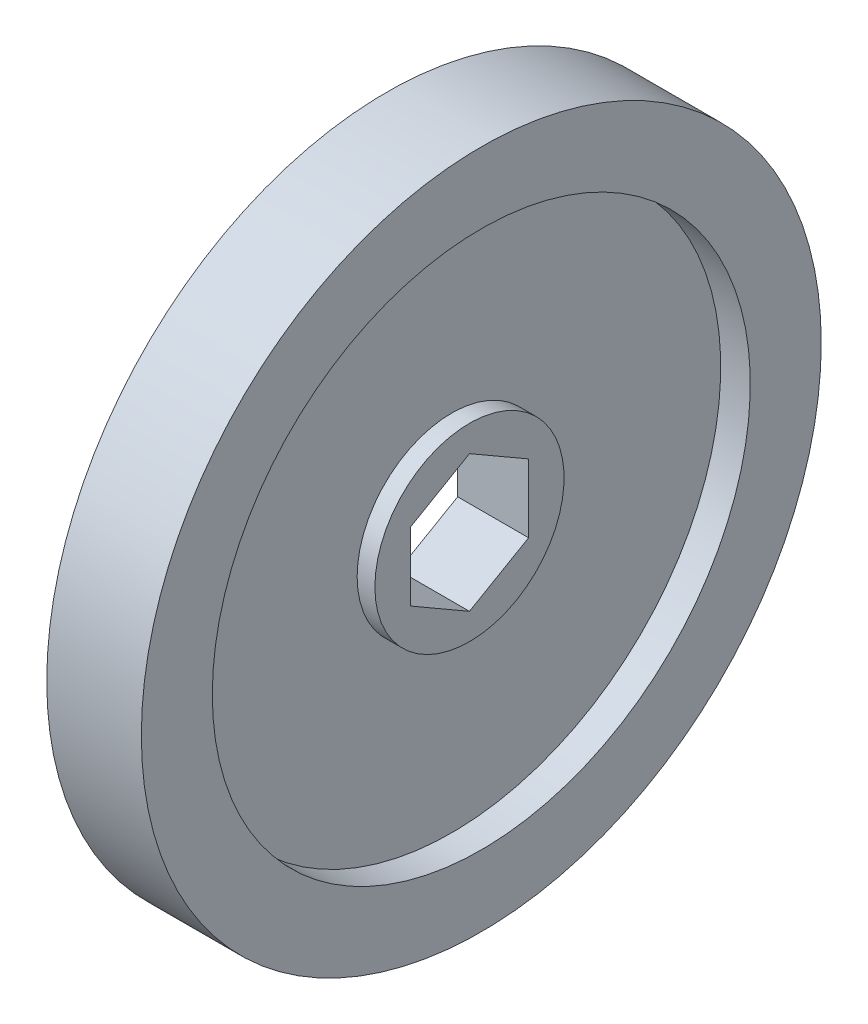
ISO-10303-21;
HEADER;
FILE_DESCRIPTION(('STEP AP214'),'2;1');
FILE_NAME('part.step','',(''),(''),'','','');
FILE_SCHEMA(('AUTOMOTIVE_DESIGN { 1 0 10303 214 1 1 1 1 }'));
ENDSEC;
DATA;
#1=APPLICATION_CONTEXT('core data for automotive mechanical design processes');
#2=APPLICATION_PROTOCOL_DEFINITION('international standard','automotive_design',2000,#1);
#3=PRODUCT_CONTEXT('',#1,'mechanical');
#4=PRODUCT('Part','Part','',(#3));
#5=PRODUCT_RELATED_PRODUCT_CATEGORY('part','',(#4));
#6=PRODUCT_DEFINITION_FORMATION('','',#4);
#7=PRODUCT_DEFINITION_CONTEXT('part definition',#1,'design');
#8=PRODUCT_DEFINITION('design','',#6,#7);
#9=PRODUCT_DEFINITION_SHAPE('','',#8);
#10=(LENGTH_UNIT() NAMED_UNIT(*) SI_UNIT(.MILLI.,.METRE.));
#11=(NAMED_UNIT(*) PLANE_ANGLE_UNIT() SI_UNIT($,.RADIAN.));
#12=(NAMED_UNIT(*) SI_UNIT($,.STERADIAN.) SOLID_ANGLE_UNIT());
#13=UNCERTAINTY_MEASURE_WITH_UNIT(LENGTH_MEASURE(1.E-05),#10,'distance_accuracy_value','');
#14=(GEOMETRIC_REPRESENTATION_CONTEXT(3) GLOBAL_UNCERTAINTY_ASSIGNED_CONTEXT((#13)) GLOBAL_UNIT_ASSIGNED_CONTEXT((#10,
#11,#12)) REPRESENTATION_CONTEXT('',''));
#15=CARTESIAN_POINT('',(0.,0.,0.));
#16=DIRECTION('',(0.,0.,1.));
#17=DIRECTION('',(1.,0.,0.));
#18=AXIS2_PLACEMENT_3D('',#15,#16,#17);
#19=CARTESIAN_POINT('',(5.08,36.5125,0.));
#20=DIRECTION('',(-1.,0.,0.));
#21=DIRECTION('',(0.,0.,1.));
#22=AXIS2_PLACEMENT_3D('',#19,#20,#21);
#23=PLANE('',#22);
#24=CARTESIAN_POINT('',(5.08,0.,0.));
#25=DIRECTION('',(-1.,0.,0.));
#26=DIRECTION('',(0.,0.,1.));
#27=AXIS2_PLACEMENT_3D('',#24,#25,#26);
#28=CIRCLE('',#27,36.5125);
#29=CARTESIAN_POINT('',(5.08,0.,36.5125));
#30=VERTEX_POINT('',#29);
#31=EDGE_CURVE('E118',#30,#30,#28,.T.);
#32=ORIENTED_EDGE('',*,*,#31,.F.);
#33=EDGE_LOOP('',(#32));
#34=FACE_BOUND('',#33,.T.);
#35=CARTESIAN_POINT('',(5.08,0.,0.));
#36=DIRECTION('',(-1.,0.,0.));
#37=DIRECTION('',(0.,0.,1.));
#38=AXIS2_PLACEMENT_3D('',#35,#36,#37);
#39=CIRCLE('',#38,28.8925);
#40=CARTESIAN_POINT('',(5.08,0.,28.8925));
#41=VERTEX_POINT('',#40);
#42=EDGE_CURVE('E151',#41,#41,#39,.T.);
#43=ORIENTED_EDGE('',*,*,#42,.T.);
#44=EDGE_LOOP('',(#43));
#45=FACE_BOUND('',#44,.T.);
#46=ADVANCED_FACE('F33',(#34,#45),#23,.F.);
#47=CARTESIAN_POINT('',(-12.5660346603092,0.,0.));
#48=DIRECTION('',(-1.,0.,0.));
#49=DIRECTION('',(0.,0.,1.));
#50=AXIS2_PLACEMENT_3D('',#47,#48,#49);
#51=CYLINDRICAL_SURFACE('',#50,28.8925);
#52=ORIENTED_EDGE('',*,*,#42,.F.);
#53=EDGE_LOOP('',(#52));
#54=FACE_BOUND('',#53,.T.);
#55=CARTESIAN_POINT('',(1.905,0.,0.));
#56=DIRECTION('',(-1.,0.,0.));
#57=DIRECTION('',(0.,0.,1.));
#58=AXIS2_PLACEMENT_3D('',#55,#56,#57);
#59=CIRCLE('',#58,28.8925);
#60=CARTESIAN_POINT('',(1.905,0.,28.8925));
#61=VERTEX_POINT('',#60);
#62=EDGE_CURVE('E148',#61,#61,#59,.T.);
#63=ORIENTED_EDGE('',*,*,#62,.T.);
#64=EDGE_LOOP('',(#63));
#65=FACE_BOUND('',#64,.T.);
#66=ADVANCED_FACE('F190',(#54,#65),#51,.F.);
#67=CARTESIAN_POINT('',(1.905,28.8925,0.));
#68=DIRECTION('',(-1.,0.,0.));
#69=DIRECTION('',(0.,0.,1.));
#70=AXIS2_PLACEMENT_3D('',#67,#68,#69);
#71=PLANE('',#70);
#72=ORIENTED_EDGE('',*,*,#62,.F.);
#73=EDGE_LOOP('',(#72));
#74=FACE_BOUND('',#73,.T.);
#75=CARTESIAN_POINT('',(1.905,0.,0.));
#76=DIRECTION('',(-1.,0.,0.));
#77=DIRECTION('',(0.,0.,1.));
#78=AXIS2_PLACEMENT_3D('',#75,#76,#77);
#79=CIRCLE('',#78,10.16);
#80=CARTESIAN_POINT('',(1.905,0.,10.16));
#81=VERTEX_POINT('',#80);
#82=EDGE_CURVE('E145',#81,#81,#79,.T.);
#83=ORIENTED_EDGE('',*,*,#82,.T.);
#84=EDGE_LOOP('',(#83));
#85=FACE_BOUND('',#84,.T.);
#86=ADVANCED_FACE('F195',(#74,#85),#71,.F.);
#87=CARTESIAN_POINT('',(-12.5660346603092,0.,0.));
#88=DIRECTION('',(-1.,0.,0.));
#89=DIRECTION('',(0.,0.,1.));
#90=AXIS2_PLACEMENT_3D('',#87,#88,#89);
#91=CYLINDRICAL_SURFACE('',#90,10.16);
#92=ORIENTED_EDGE('',*,*,#82,.F.);
#93=EDGE_LOOP('',(#92));
#94=FACE_BOUND('',#93,.T.);
#95=CARTESIAN_POINT('',(3.81,0.,0.));
#96=DIRECTION('',(-1.,0.,0.));
#97=DIRECTION('',(0.,0.,1.));
#98=AXIS2_PLACEMENT_3D('',#95,#96,#97);
#99=CIRCLE('',#98,10.16);
#100=CARTESIAN_POINT('',(3.81,0.,10.16));
#101=VERTEX_POINT('',#100);
#102=EDGE_CURVE('E142',#101,#101,#99,.T.);
#103=ORIENTED_EDGE('',*,*,#102,.T.);
#104=EDGE_LOOP('',(#103));
#105=FACE_BOUND('',#104,.T.);
#106=ADVANCED_FACE('F205',(#94,#105),#91,.T.);
#107=CARTESIAN_POINT('',(3.81,10.16,0.));
#108=DIRECTION('',(-1.,0.,0.));
#109=DIRECTION('',(0.,0.,1.));
#110=AXIS2_PLACEMENT_3D('',#107,#108,#109);
#111=PLANE('',#110);
#112=DIRECTION('',(0.,-0.5,0.866025403784439));
#113=VECTOR('',#112,1.);
#114=CARTESIAN_POINT('',(3.81,7.33234841870825,0.));
#115=LINE('',#114,#113);
#116=CARTESIAN_POINT('',(3.81,7.33234841870825,0.));
#117=VERTEX_POINT('',#116);
#118=CARTESIAN_POINT('',(3.81,3.66617420935413,6.35));
#119=VERTEX_POINT('',#118);
#120=EDGE_CURVE('E97',#117,#119,#115,.T.);
#121=ORIENTED_EDGE('',*,*,#120,.F.);
#122=DIRECTION('',(0.,0.5,0.866025403784439));
#123=VECTOR('',#122,1.);
#124=CARTESIAN_POINT('',(3.81,3.66617420935412,-6.35));
#125=LINE('',#124,#123);
#126=CARTESIAN_POINT('',(3.81,3.66617420935412,-6.35));
#127=VERTEX_POINT('',#126);
#128=EDGE_CURVE('E47',#127,#117,#125,.T.);
#129=ORIENTED_EDGE('',*,*,#128,.F.);
#130=DIRECTION('',(0.,1.,0.));
#131=VECTOR('',#130,1.);
#132=CARTESIAN_POINT('',(3.81,-3.66617420935413,-6.35));
#133=LINE('',#132,#131);
#134=CARTESIAN_POINT('',(3.81,-3.66617420935413,-6.35));
#135=VERTEX_POINT('',#134);
#136=EDGE_CURVE('E113',#135,#127,#133,.T.);
#137=ORIENTED_EDGE('',*,*,#136,.F.);
#138=DIRECTION('',(0.,0.5,-0.866025403784439));
#139=VECTOR('',#138,1.);
#140=CARTESIAN_POINT('',(3.81,-7.33234841870825,0.));
#141=LINE('',#140,#139);
#142=CARTESIAN_POINT('',(3.81,-7.33234841870825,0.));
#143=VERTEX_POINT('',#142);
#144=EDGE_CURVE('E107',#143,#135,#141,.T.);
#145=ORIENTED_EDGE('',*,*,#144,.F.);
#146=DIRECTION('',(0.,-0.5,-0.866025403784439));
#147=VECTOR('',#146,1.);
#148=CARTESIAN_POINT('',(3.81,-3.66617420935413,6.35));
#149=LINE('',#148,#147);
#150=CARTESIAN_POINT('',(3.81,-3.66617420935413,6.35));
#151=VERTEX_POINT('',#150);
#152=EDGE_CURVE('E105',#151,#143,#149,.T.);
#153=ORIENTED_EDGE('',*,*,#152,.F.);
#154=DIRECTION('',(0.,-1.,0.));
#155=VECTOR('',#154,1.);
#156=CARTESIAN_POINT('',(3.81,3.66617420935413,6.35));
#157=LINE('',#156,#155);
#158=EDGE_CURVE('E88',#119,#151,#157,.T.);
#159=ORIENTED_EDGE('',*,*,#158,.F.);
#160=EDGE_LOOP('',(#121,#129,#137,#145,#153,#159));
#161=FACE_BOUND('',#160,.T.);
#162=ORIENTED_EDGE('',*,*,#102,.F.);
#163=EDGE_LOOP('',(#162));
#164=FACE_BOUND('',#163,.T.);
#165=ADVANCED_FACE('F101',(#161,#164),#111,.F.);
#166=CARTESIAN_POINT('',(-3.81,10.16,0.));
#167=DIRECTION('',(1.,0.,0.));
#168=DIRECTION('',(0.,0.,-1.));
#169=AXIS2_PLACEMENT_3D('',#166,#167,#168);
#170=PLANE('',#169);
#171=DIRECTION('',(0.,1.,0.));
#172=VECTOR('',#171,1.);
#173=CARTESIAN_POINT('',(-3.81,10.16,-6.35));
#174=LINE('',#173,#172);
#175=CARTESIAN_POINT('',(-3.81,-3.66617420935413,-6.35));
#176=VERTEX_POINT('',#175);
#177=CARTESIAN_POINT('',(-3.81,3.66617420935412,-6.35));
#178=VERTEX_POINT('',#177);
#179=EDGE_CURVE('E40',#176,#178,#174,.T.);
#180=ORIENTED_EDGE('',*,*,#179,.T.);
#181=DIRECTION('',(0.,0.5,0.866025403784439));
#182=VECTOR('',#181,1.);
#183=CARTESIAN_POINT('',(-3.81,8.03926131403118,1.22440905122495));
#184=LINE('',#183,#182);
#185=CARTESIAN_POINT('',(-3.81,7.33234841870825,0.));
#186=VERTEX_POINT('',#185);
#187=EDGE_CURVE('E11',#178,#186,#184,.T.);
#188=ORIENTED_EDGE('',*,*,#187,.T.);
#189=DIRECTION('',(0.,-0.5,0.866025403784439));
#190=VECTOR('',#189,1.);
#191=CARTESIAN_POINT('',(-3.81,8.03926131403118,-1.22440905122495));
#192=LINE('',#191,#190);
#193=CARTESIAN_POINT('',(-3.81,3.66617420935413,6.35));
#194=VERTEX_POINT('',#193);
#195=EDGE_CURVE('E154',#186,#194,#192,.T.);
#196=ORIENTED_EDGE('',*,*,#195,.T.);
#197=DIRECTION('',(0.,-1.,0.));
#198=VECTOR('',#197,1.);
#199=CARTESIAN_POINT('',(-3.81,10.16,6.35));
#200=LINE('',#199,#198);
#201=CARTESIAN_POINT('',(-3.81,-3.66617420935413,6.35));
#202=VERTEX_POINT('',#201);
#203=EDGE_CURVE('E91',#194,#202,#200,.T.);
#204=ORIENTED_EDGE('',*,*,#203,.T.);
#205=DIRECTION('',(0.,-0.5,-0.866025403784439));
#206=VECTOR('',#205,1.);
#207=CARTESIAN_POINT('',(-3.81,-2.95926131403119,7.57440905122495));
#208=LINE('',#207,#206);
#209=CARTESIAN_POINT('',(-3.81,-7.33234841870825,0.));
#210=VERTEX_POINT('',#209);
#211=EDGE_CURVE('E157',#202,#210,#208,.T.);
#212=ORIENTED_EDGE('',*,*,#211,.T.);
#213=DIRECTION('',(0.,0.5,-0.866025403784439));
#214=VECTOR('',#213,1.);
#215=CARTESIAN_POINT('',(-3.81,-2.95926131403119,-7.57440905122495));
#216=LINE('',#215,#214);
#217=EDGE_CURVE('E160',#210,#176,#216,.T.);
#218=ORIENTED_EDGE('',*,*,#217,.T.);
#219=EDGE_LOOP('',(#180,#188,#196,#204,#212,#218));
#220=FACE_BOUND('',#219,.T.);
#221=CARTESIAN_POINT('',(-3.81,0.,0.));
#222=DIRECTION('',(-1.,0.,0.));
#223=DIRECTION('',(0.,0.,1.));
#224=AXIS2_PLACEMENT_3D('',#221,#222,#223);
#225=CIRCLE('',#224,10.16);
#226=CARTESIAN_POINT('',(-3.81,0.,10.16));
#227=VERTEX_POINT('',#226);
#228=EDGE_CURVE('E139',#227,#227,#225,.T.);
#229=ORIENTED_EDGE('',*,*,#228,.T.);
#230=EDGE_LOOP('',(#229));
#231=FACE_BOUND('',#230,.T.);
#232=ADVANCED_FACE('F164',(#220,#231),#170,.F.);
#233=CARTESIAN_POINT('',(-12.5660346603092,0.,0.));
#234=DIRECTION('',(-1.,0.,0.));
#235=DIRECTION('',(0.,0.,1.));
#236=AXIS2_PLACEMENT_3D('',#233,#234,#235);
#237=CYLINDRICAL_SURFACE('',#236,10.16);
#238=ORIENTED_EDGE('',*,*,#228,.F.);
#239=EDGE_LOOP('',(#238));
#240=FACE_BOUND('',#239,.T.);
#241=CARTESIAN_POINT('',(-1.905,0.,0.));
#242=DIRECTION('',(-1.,0.,0.));
#243=DIRECTION('',(0.,0.,1.));
#244=AXIS2_PLACEMENT_3D('',#241,#242,#243);
#245=CIRCLE('',#244,10.16);
#246=CARTESIAN_POINT('',(-1.905,0.,10.16));
#247=VERTEX_POINT('',#246);
#248=EDGE_CURVE('E136',#247,#247,#245,.T.);
#249=ORIENTED_EDGE('',*,*,#248,.T.);
#250=EDGE_LOOP('',(#249));
#251=FACE_BOUND('',#250,.T.);
#252=ADVANCED_FACE('F218',(#240,#251),#237,.T.);
#253=CARTESIAN_POINT('',(-1.905,28.8925,0.));
#254=DIRECTION('',(1.,0.,0.));
#255=DIRECTION('',(0.,0.,-1.));
#256=AXIS2_PLACEMENT_3D('',#253,#254,#255);
#257=PLANE('',#256);
#258=ORIENTED_EDGE('',*,*,#248,.F.);
#259=EDGE_LOOP('',(#258));
#260=FACE_BOUND('',#259,.T.);
#261=CARTESIAN_POINT('',(-1.905,0.,0.));
#262=DIRECTION('',(-1.,0.,0.));
#263=DIRECTION('',(0.,0.,1.));
#264=AXIS2_PLACEMENT_3D('',#261,#262,#263);
#265=CIRCLE('',#264,28.8925);
#266=CARTESIAN_POINT('',(-1.905,0.,28.8925));
#267=VERTEX_POINT('',#266);
#268=EDGE_CURVE('E133',#267,#267,#265,.T.);
#269=ORIENTED_EDGE('',*,*,#268,.T.);
#270=EDGE_LOOP('',(#269));
#271=FACE_BOUND('',#270,.T.);
#272=ADVANCED_FACE('F223',(#260,#271),#257,.F.);
#273=CARTESIAN_POINT('',(-12.5660346603092,0.,0.));
#274=DIRECTION('',(-1.,0.,0.));
#275=DIRECTION('',(0.,0.,1.));
#276=AXIS2_PLACEMENT_3D('',#273,#274,#275);
#277=CYLINDRICAL_SURFACE('',#276,28.8925);
#278=ORIENTED_EDGE('',*,*,#268,.F.);
#279=EDGE_LOOP('',(#278));
#280=FACE_BOUND('',#279,.T.);
#281=CARTESIAN_POINT('',(-5.08,0.,0.));
#282=DIRECTION('',(-1.,0.,0.));
#283=DIRECTION('',(0.,0.,1.));
#284=AXIS2_PLACEMENT_3D('',#281,#282,#283);
#285=CIRCLE('',#284,28.8925);
#286=CARTESIAN_POINT('',(-5.08,0.,28.8925));
#287=VERTEX_POINT('',#286);
#288=EDGE_CURVE('E130',#287,#287,#285,.T.);
#289=ORIENTED_EDGE('',*,*,#288,.T.);
#290=EDGE_LOOP('',(#289));
#291=FACE_BOUND('',#290,.T.);
#292=ADVANCED_FACE('F227',(#280,#291),#277,.F.);
#293=CARTESIAN_POINT('',(-5.08,36.5125,0.));
#294=DIRECTION('',(1.,0.,0.));
#295=DIRECTION('',(0.,0.,-1.));
#296=AXIS2_PLACEMENT_3D('',#293,#294,#295);
#297=PLANE('',#296);
#298=ORIENTED_EDGE('',*,*,#288,.F.);
#299=EDGE_LOOP('',(#298));
#300=FACE_BOUND('',#299,.T.);
#301=CARTESIAN_POINT('',(-5.08,0.,0.));
#302=DIRECTION('',(-1.,0.,0.));
#303=DIRECTION('',(0.,0.,1.));
#304=AXIS2_PLACEMENT_3D('',#301,#302,#303);
#305=CIRCLE('',#304,36.5125);
#306=CARTESIAN_POINT('',(-5.08,0.,36.5125));
#307=VERTEX_POINT('',#306);
#308=EDGE_CURVE('E127',#307,#307,#305,.T.);
#309=ORIENTED_EDGE('',*,*,#308,.T.);
#310=EDGE_LOOP('',(#309));
#311=FACE_BOUND('',#310,.T.);
#312=ADVANCED_FACE('F185',(#300,#311),#297,.F.);
#313=CARTESIAN_POINT('',(-12.5660346603092,0.,0.));
#314=DIRECTION('',(-1.,0.,0.));
#315=DIRECTION('',(0.,0.,1.));
#316=AXIS2_PLACEMENT_3D('',#313,#314,#315);
#317=CYLINDRICAL_SURFACE('',#316,36.5125);
#318=ORIENTED_EDGE('',*,*,#308,.F.);
#319=EDGE_LOOP('',(#318));
#320=FACE_BOUND('',#319,.T.);
#321=ORIENTED_EDGE('',*,*,#31,.T.);
#322=EDGE_LOOP('',(#321));
#323=FACE_BOUND('',#322,.T.);
#324=ADVANCED_FACE('F178',(#320,#323),#317,.T.);
#325=CARTESIAN_POINT('',(-5.08,3.66617420935412,-6.35));
#326=DIRECTION('',(0.,0.866025403784439,-0.5));
#327=DIRECTION('',(0.,0.5,0.866025403784439));
#328=AXIS2_PLACEMENT_3D('',#325,#326,#327);
#329=PLANE('',#328);
#330=DIRECTION('',(1.,0.,0.));
#331=VECTOR('',#330,1.);
#332=CARTESIAN_POINT('',(-5.08,3.66617420935412,-6.35));
#333=LINE('',#332,#331);
#334=EDGE_CURVE('E116',#178,#127,#333,.T.);
#335=ORIENTED_EDGE('',*,*,#334,.T.);
#336=ORIENTED_EDGE('',*,*,#128,.T.);
#337=DIRECTION('',(1.,0.,0.));
#338=VECTOR('',#337,1.);
#339=CARTESIAN_POINT('',(-5.08,7.33234841870825,0.));
#340=LINE('',#339,#338);
#341=EDGE_CURVE('E94',#186,#117,#340,.T.);
#342=ORIENTED_EDGE('',*,*,#341,.F.);
#343=ORIENTED_EDGE('',*,*,#187,.F.);
#344=EDGE_LOOP('',(#335,#336,#342,#343));
#345=FACE_BOUND('',#344,.T.);
#346=ADVANCED_FACE('F176',(#345),#329,.F.);
#347=CARTESIAN_POINT('',(-5.08,-3.66617420935413,-6.35));
#348=DIRECTION('',(0.,0.,-1.));
#349=DIRECTION('',(0.,1.,0.));
#350=AXIS2_PLACEMENT_3D('',#347,#348,#349);
#351=PLANE('',#350);
#352=DIRECTION('',(1.,0.,0.));
#353=VECTOR('',#352,1.);
#354=CARTESIAN_POINT('',(-5.08,-3.66617420935413,-6.35));
#355=LINE('',#354,#353);
#356=EDGE_CURVE('E119',#176,#135,#355,.T.);
#357=ORIENTED_EDGE('',*,*,#356,.T.);
#358=ORIENTED_EDGE('',*,*,#136,.T.);
#359=ORIENTED_EDGE('',*,*,#334,.F.);
#360=ORIENTED_EDGE('',*,*,#179,.F.);
#361=EDGE_LOOP('',(#357,#358,#359,#360));
#362=FACE_BOUND('',#361,.T.);
#363=ADVANCED_FACE('F169',(#362),#351,.F.);
#364=CARTESIAN_POINT('',(-5.08,-7.33234841870825,0.));
#365=DIRECTION('',(0.,-0.866025403784439,-0.5));
#366=DIRECTION('',(0.,0.5,-0.866025403784439));
#367=AXIS2_PLACEMENT_3D('',#364,#365,#366);
#368=PLANE('',#367);
#369=DIRECTION('',(1.,0.,0.));
#370=VECTOR('',#369,1.);
#371=CARTESIAN_POINT('',(-5.08,-7.33234841870825,0.));
#372=LINE('',#371,#370);
#373=EDGE_CURVE('E121',#210,#143,#372,.T.);
#374=ORIENTED_EDGE('',*,*,#373,.T.);
#375=ORIENTED_EDGE('',*,*,#144,.T.);
#376=ORIENTED_EDGE('',*,*,#356,.F.);
#377=ORIENTED_EDGE('',*,*,#217,.F.);
#378=EDGE_LOOP('',(#374,#375,#376,#377));
#379=FACE_BOUND('',#378,.T.);
#380=ADVANCED_FACE('F171',(#379),#368,.F.);
#381=CARTESIAN_POINT('',(-5.08,-3.66617420935413,6.35));
#382=DIRECTION('',(0.,-0.866025403784439,0.5));
#383=DIRECTION('',(0.,-0.5,-0.866025403784439));
#384=AXIS2_PLACEMENT_3D('',#381,#382,#383);
#385=PLANE('',#384);
#386=DIRECTION('',(1.,0.,0.));
#387=VECTOR('',#386,1.);
#388=CARTESIAN_POINT('',(-5.08,-3.66617420935413,6.35));
#389=LINE('',#388,#387);
#390=EDGE_CURVE('E93',#202,#151,#389,.T.);
#391=ORIENTED_EDGE('',*,*,#390,.T.);
#392=ORIENTED_EDGE('',*,*,#152,.T.);
#393=ORIENTED_EDGE('',*,*,#373,.F.);
#394=ORIENTED_EDGE('',*,*,#211,.F.);
#395=EDGE_LOOP('',(#391,#392,#393,#394));
#396=FACE_BOUND('',#395,.T.);
#397=ADVANCED_FACE('F175',(#396),#385,.F.);
#398=CARTESIAN_POINT('',(-5.08,3.66617420935413,6.35));
#399=DIRECTION('',(0.,0.,1.));
#400=DIRECTION('',(0.,-1.,0.));
#401=AXIS2_PLACEMENT_3D('',#398,#399,#400);
#402=PLANE('',#401);
#403=DIRECTION('',(1.,0.,0.));
#404=VECTOR('',#403,1.);
#405=CARTESIAN_POINT('',(-5.08,3.66617420935413,6.35));
#406=LINE('',#405,#404);
#407=EDGE_CURVE('E55',#194,#119,#406,.T.);
#408=ORIENTED_EDGE('',*,*,#407,.T.);
#409=ORIENTED_EDGE('',*,*,#158,.T.);
#410=ORIENTED_EDGE('',*,*,#390,.F.);
#411=ORIENTED_EDGE('',*,*,#203,.F.);
#412=EDGE_LOOP('',(#408,#409,#410,#411));
#413=FACE_BOUND('',#412,.T.);
#414=ADVANCED_FACE('F85',(#413),#402,.F.);
#415=CARTESIAN_POINT('',(-5.08,7.33234841870825,0.));
#416=DIRECTION('',(0.,0.866025403784439,0.5));
#417=DIRECTION('',(0.,-0.5,0.866025403784439));
#418=AXIS2_PLACEMENT_3D('',#415,#416,#417);
#419=PLANE('',#418);
#420=ORIENTED_EDGE('',*,*,#341,.T.);
#421=ORIENTED_EDGE('',*,*,#120,.T.);
#422=ORIENTED_EDGE('',*,*,#407,.F.);
#423=ORIENTED_EDGE('',*,*,#195,.F.);
#424=EDGE_LOOP('',(#420,#421,#422,#423));
#425=FACE_BOUND('',#424,.T.);
#426=ADVANCED_FACE('F98',(#425),#419,.F.);
#427=CLOSED_SHELL('',(#46,#66,#86,#106,#165,#232,#252,#272,#292,#312,#324,#346,#363,#380,#397,
#414,#426));
#428=MANIFOLD_SOLID_BREP('B2',#427);
#429=ADVANCED_BREP_SHAPE_REPRESENTATION('',(#18,#428),#14);
#430=SHAPE_DEFINITION_REPRESENTATION(#9,#429);
ENDSEC;
END-ISO-10303-21;
